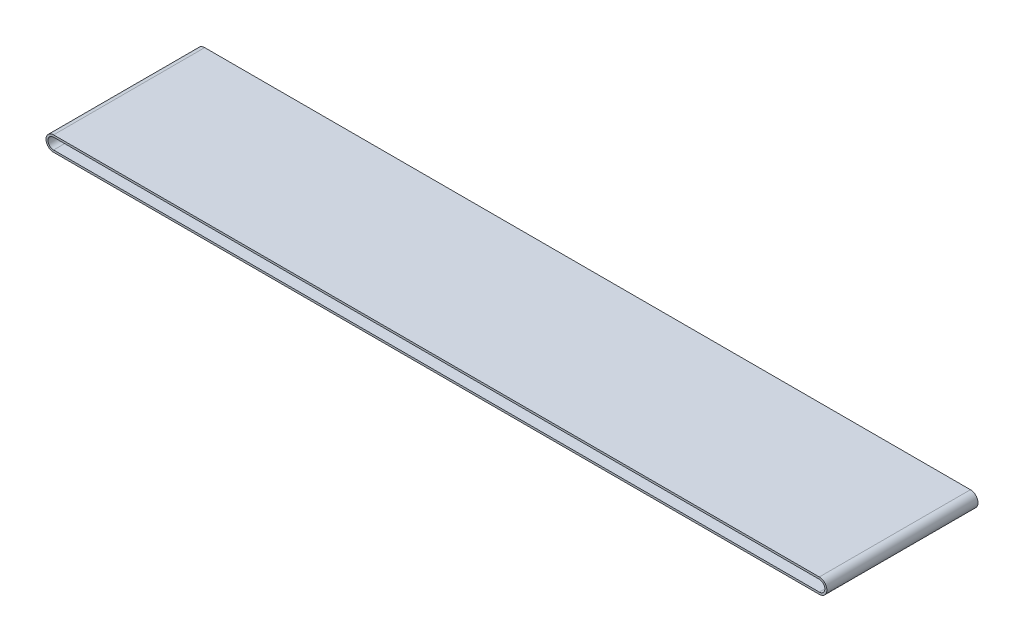
ISO-10303-21;
HEADER;
FILE_DESCRIPTION(('STEP AP214'),'2;1');
FILE_NAME('part.step','',(''),(''),'','','');
FILE_SCHEMA(('AUTOMOTIVE_DESIGN { 1 0 10303 214 1 1 1 1 }'));
ENDSEC;
DATA;
#1=APPLICATION_CONTEXT('core data for automotive mechanical design processes');
#2=APPLICATION_PROTOCOL_DEFINITION('international standard','automotive_design',2000,#1);
#3=PRODUCT_CONTEXT('',#1,'mechanical');
#4=PRODUCT('Part','Part','',(#3));
#5=PRODUCT_RELATED_PRODUCT_CATEGORY('part','',(#4));
#6=PRODUCT_DEFINITION_FORMATION('','',#4);
#7=PRODUCT_DEFINITION_CONTEXT('part definition',#1,'design');
#8=PRODUCT_DEFINITION('design','',#6,#7);
#9=PRODUCT_DEFINITION_SHAPE('','',#8);
#10=(LENGTH_UNIT() NAMED_UNIT(*) SI_UNIT(.MILLI.,.METRE.));
#11=(NAMED_UNIT(*) PLANE_ANGLE_UNIT() SI_UNIT($,.RADIAN.));
#12=(NAMED_UNIT(*) SI_UNIT($,.STERADIAN.) SOLID_ANGLE_UNIT());
#13=UNCERTAINTY_MEASURE_WITH_UNIT(LENGTH_MEASURE(1.E-05),#10,'distance_accuracy_value','');
#14=(GEOMETRIC_REPRESENTATION_CONTEXT(3) GLOBAL_UNCERTAINTY_ASSIGNED_CONTEXT((#13)) GLOBAL_UNIT_ASSIGNED_CONTEXT((#10,
#11,#12)) REPRESENTATION_CONTEXT('',''));
#15=CARTESIAN_POINT('',(0.,0.,0.));
#16=DIRECTION('',(0.,0.,1.));
#17=DIRECTION('',(1.,0.,0.));
#18=AXIS2_PLACEMENT_3D('',#15,#16,#17);
#19=CARTESIAN_POINT('',(0.,0.,381.));
#20=DIRECTION('',(0.,0.,1.));
#21=DIRECTION('',(1.,0.,0.));
#22=AXIS2_PLACEMENT_3D('',#19,#20,#21);
#23=PLANE('',#22);
#24=CARTESIAN_POINT('',(0.,0.,381.));
#25=DIRECTION('',(0.,0.,1.));
#26=DIRECTION('',(1.,0.,0.));
#27=AXIS2_PLACEMENT_3D('',#24,#25,#26);
#28=CIRCLE('',#27,38.0999999999998);
#29=CARTESIAN_POINT('',(0.,38.0999999999998,381.));
#30=VERTEX_POINT('',#29);
#31=CARTESIAN_POINT('',(0.,-38.0999999999998,381.));
#32=VERTEX_POINT('',#31);
#33=EDGE_CURVE('E140',#30,#32,#28,.T.);
#34=ORIENTED_EDGE('',*,*,#33,.T.);
#35=DIRECTION('',(1.,0.,0.));
#36=VECTOR('',#35,1.);
#37=CARTESIAN_POINT('',(0.,-38.0999999999998,381.));
#38=LINE('',#37,#36);
#39=CARTESIAN_POINT('',(3860.8,-38.0999999999998,381.));
#40=VERTEX_POINT('',#39);
#41=EDGE_CURVE('E143',#32,#40,#38,.T.);
#42=ORIENTED_EDGE('',*,*,#41,.T.);
#43=CARTESIAN_POINT('',(3860.8,0.,381.));
#44=DIRECTION('',(0.,0.,1.));
#45=DIRECTION('',(1.,0.,0.));
#46=AXIS2_PLACEMENT_3D('',#43,#44,#45);
#47=CIRCLE('',#46,38.0999999999998);
#48=CARTESIAN_POINT('',(3860.8,38.0999999999998,381.));
#49=VERTEX_POINT('',#48);
#50=EDGE_CURVE('E146',#40,#49,#47,.T.);
#51=ORIENTED_EDGE('',*,*,#50,.T.);
#52=DIRECTION('',(-1.,0.,0.));
#53=VECTOR('',#52,1.);
#54=CARTESIAN_POINT('',(0.,38.0999999999998,381.));
#55=LINE('',#54,#53);
#56=EDGE_CURVE('E148',#49,#30,#55,.T.);
#57=ORIENTED_EDGE('',*,*,#56,.T.);
#58=EDGE_LOOP('',(#34,#42,#51,#57));
#59=FACE_BOUND('',#58,.T.);
#60=DIRECTION('',(1.,0.,0.));
#61=VECTOR('',#60,1.);
#62=CARTESIAN_POINT('',(0.,-27.9399999999998,381.));
#63=LINE('',#62,#61);
#64=CARTESIAN_POINT('',(0.,-27.9399999999998,381.));
#65=VERTEX_POINT('',#64);
#66=CARTESIAN_POINT('',(3860.8,-27.9399999999998,381.));
#67=VERTEX_POINT('',#66);
#68=EDGE_CURVE('E112',#65,#67,#63,.T.);
#69=ORIENTED_EDGE('',*,*,#68,.F.);
#70=CARTESIAN_POINT('',(0.,0.,381.));
#71=DIRECTION('',(0.,0.,1.));
#72=DIRECTION('',(1.,0.,0.));
#73=AXIS2_PLACEMENT_3D('',#70,#71,#72);
#74=CIRCLE('',#73,27.94);
#75=CARTESIAN_POINT('',(0.,27.9400000000002,381.));
#76=VERTEX_POINT('',#75);
#77=EDGE_CURVE('E104',#76,#65,#74,.T.);
#78=ORIENTED_EDGE('',*,*,#77,.F.);
#79=DIRECTION('',(-1.,0.,0.));
#80=VECTOR('',#79,1.);
#81=CARTESIAN_POINT('',(0.,27.9400000000002,381.));
#82=LINE('',#81,#80);
#83=CARTESIAN_POINT('',(3860.8,27.9399999999998,381.));
#84=VERTEX_POINT('',#83);
#85=EDGE_CURVE('E126',#84,#76,#82,.T.);
#86=ORIENTED_EDGE('',*,*,#85,.F.);
#87=CARTESIAN_POINT('',(3860.8,0.,381.));
#88=DIRECTION('',(0.,0.,1.));
#89=DIRECTION('',(1.,0.,0.));
#90=AXIS2_PLACEMENT_3D('',#87,#88,#89);
#91=CIRCLE('',#90,27.9399999999998);
#92=EDGE_CURVE('E124',#67,#84,#91,.T.);
#93=ORIENTED_EDGE('',*,*,#92,.F.);
#94=EDGE_LOOP('',(#69,#78,#86,#93));
#95=FACE_BOUND('',#94,.T.);
#96=ADVANCED_FACE('F39',(#59,#95),#23,.T.);
#97=CARTESIAN_POINT('',(0.,0.,-381.));
#98=DIRECTION('',(0.,0.,1.));
#99=DIRECTION('',(1.,0.,0.));
#100=AXIS2_PLACEMENT_3D('',#97,#98,#99);
#101=PLANE('',#100);
#102=CARTESIAN_POINT('',(0.,0.,-381.));
#103=DIRECTION('',(0.,0.,1.));
#104=DIRECTION('',(1.,0.,0.));
#105=AXIS2_PLACEMENT_3D('',#102,#103,#104);
#106=CIRCLE('',#105,38.0999999999998);
#107=CARTESIAN_POINT('',(0.,38.0999999999998,-381.));
#108=VERTEX_POINT('',#107);
#109=CARTESIAN_POINT('',(0.,-38.0999999999998,-381.));
#110=VERTEX_POINT('',#109);
#111=EDGE_CURVE('E120',#108,#110,#106,.T.);
#112=ORIENTED_EDGE('',*,*,#111,.F.);
#113=DIRECTION('',(-1.,0.,0.));
#114=VECTOR('',#113,1.);
#115=CARTESIAN_POINT('',(0.,38.0999999999998,-381.));
#116=LINE('',#115,#114);
#117=CARTESIAN_POINT('',(3860.8,38.0999999999998,-381.));
#118=VERTEX_POINT('',#117);
#119=EDGE_CURVE('E144',#118,#108,#116,.T.);
#120=ORIENTED_EDGE('',*,*,#119,.F.);
#121=CARTESIAN_POINT('',(3860.8,0.,-381.));
#122=DIRECTION('',(0.,0.,1.));
#123=DIRECTION('',(1.,0.,0.));
#124=AXIS2_PLACEMENT_3D('',#121,#122,#123);
#125=CIRCLE('',#124,38.0999999999998);
#126=CARTESIAN_POINT('',(3860.8,-38.0999999999998,-381.));
#127=VERTEX_POINT('',#126);
#128=EDGE_CURVE('E155',#127,#118,#125,.T.);
#129=ORIENTED_EDGE('',*,*,#128,.F.);
#130=DIRECTION('',(1.,0.,0.));
#131=VECTOR('',#130,1.);
#132=CARTESIAN_POINT('',(0.,-38.0999999999998,-381.));
#133=LINE('',#132,#131);
#134=EDGE_CURVE('E153',#110,#127,#133,.T.);
#135=ORIENTED_EDGE('',*,*,#134,.F.);
#136=EDGE_LOOP('',(#112,#120,#129,#135));
#137=FACE_BOUND('',#136,.T.);
#138=CARTESIAN_POINT('',(0.,0.,-381.));
#139=DIRECTION('',(0.,0.,1.));
#140=DIRECTION('',(1.,0.,0.));
#141=AXIS2_PLACEMENT_3D('',#138,#139,#140);
#142=CIRCLE('',#141,27.94);
#143=CARTESIAN_POINT('',(0.,27.9400000000002,-381.));
#144=VERTEX_POINT('',#143);
#145=CARTESIAN_POINT('',(0.,-27.9399999999998,-381.));
#146=VERTEX_POINT('',#145);
#147=EDGE_CURVE('E62',#144,#146,#142,.T.);
#148=ORIENTED_EDGE('',*,*,#147,.T.);
#149=DIRECTION('',(1.,0.,0.));
#150=VECTOR('',#149,1.);
#151=CARTESIAN_POINT('',(0.,-27.9399999999998,-381.));
#152=LINE('',#151,#150);
#153=CARTESIAN_POINT('',(3860.8,-27.9399999999998,-381.));
#154=VERTEX_POINT('',#153);
#155=EDGE_CURVE('E119',#146,#154,#152,.T.);
#156=ORIENTED_EDGE('',*,*,#155,.T.);
#157=CARTESIAN_POINT('',(3860.8,0.,-381.));
#158=DIRECTION('',(0.,0.,1.));
#159=DIRECTION('',(1.,0.,0.));
#160=AXIS2_PLACEMENT_3D('',#157,#158,#159);
#161=CIRCLE('',#160,27.9399999999998);
#162=CARTESIAN_POINT('',(3860.8,27.9399999999998,-381.));
#163=VERTEX_POINT('',#162);
#164=EDGE_CURVE('E132',#154,#163,#161,.T.);
#165=ORIENTED_EDGE('',*,*,#164,.T.);
#166=DIRECTION('',(-1.,0.,0.));
#167=VECTOR('',#166,1.);
#168=CARTESIAN_POINT('',(0.,27.9400000000002,-381.));
#169=LINE('',#168,#167);
#170=EDGE_CURVE('E113',#163,#144,#169,.T.);
#171=ORIENTED_EDGE('',*,*,#170,.T.);
#172=EDGE_LOOP('',(#148,#156,#165,#171));
#173=FACE_BOUND('',#172,.T.);
#174=ADVANCED_FACE('F173',(#137,#173),#101,.F.);
#175=CARTESIAN_POINT('',(0.,0.,381.));
#176=DIRECTION('',(0.,0.,-1.));
#177=DIRECTION('',(-1.,0.,0.));
#178=AXIS2_PLACEMENT_3D('',#175,#176,#177);
#179=CYLINDRICAL_SURFACE('',#178,38.0999999999998);
#180=ORIENTED_EDGE('',*,*,#111,.T.);
#181=DIRECTION('',(0.,0.,-1.));
#182=VECTOR('',#181,1.);
#183=CARTESIAN_POINT('',(0.,-38.0999999999998,381.));
#184=LINE('',#183,#182);
#185=EDGE_CURVE('E11',#32,#110,#184,.T.);
#186=ORIENTED_EDGE('',*,*,#185,.F.);
#187=ORIENTED_EDGE('',*,*,#33,.F.);
#188=DIRECTION('',(0.,0.,-1.));
#189=VECTOR('',#188,1.);
#190=CARTESIAN_POINT('',(0.,38.0999999999998,381.));
#191=LINE('',#190,#189);
#192=EDGE_CURVE('E150',#30,#108,#191,.T.);
#193=ORIENTED_EDGE('',*,*,#192,.T.);
#194=EDGE_LOOP('',(#180,#186,#187,#193));
#195=FACE_BOUND('',#194,.T.);
#196=ADVANCED_FACE('F41',(#195),#179,.T.);
#197=CARTESIAN_POINT('',(0.,-38.0999999999998,381.));
#198=DIRECTION('',(0.,1.,0.));
#199=DIRECTION('',(0.,0.,1.));
#200=AXIS2_PLACEMENT_3D('',#197,#198,#199);
#201=PLANE('',#200);
#202=ORIENTED_EDGE('',*,*,#134,.T.);
#203=DIRECTION('',(0.,0.,-1.));
#204=VECTOR('',#203,1.);
#205=CARTESIAN_POINT('',(3860.8,-38.0999999999998,381.));
#206=LINE('',#205,#204);
#207=EDGE_CURVE('E47',#40,#127,#206,.T.);
#208=ORIENTED_EDGE('',*,*,#207,.F.);
#209=ORIENTED_EDGE('',*,*,#41,.F.);
#210=ORIENTED_EDGE('',*,*,#185,.T.);
#211=EDGE_LOOP('',(#202,#208,#209,#210));
#212=FACE_BOUND('',#211,.T.);
#213=ADVANCED_FACE('F183',(#212),#201,.F.);
#214=CARTESIAN_POINT('',(3860.8,0.,381.));
#215=DIRECTION('',(0.,0.,-1.));
#216=DIRECTION('',(-1.,0.,0.));
#217=AXIS2_PLACEMENT_3D('',#214,#215,#216);
#218=CYLINDRICAL_SURFACE('',#217,38.0999999999998);
#219=ORIENTED_EDGE('',*,*,#128,.T.);
#220=DIRECTION('',(0.,0.,-1.));
#221=VECTOR('',#220,1.);
#222=CARTESIAN_POINT('',(3860.8,38.0999999999998,381.));
#223=LINE('',#222,#221);
#224=EDGE_CURVE('E160',#49,#118,#223,.T.);
#225=ORIENTED_EDGE('',*,*,#224,.F.);
#226=ORIENTED_EDGE('',*,*,#50,.F.);
#227=ORIENTED_EDGE('',*,*,#207,.T.);
#228=EDGE_LOOP('',(#219,#225,#226,#227));
#229=FACE_BOUND('',#228,.T.);
#230=ADVANCED_FACE('F167',(#229),#218,.T.);
#231=CARTESIAN_POINT('',(0.,38.0999999999998,381.));
#232=DIRECTION('',(0.,-1.,0.));
#233=DIRECTION('',(0.,0.,-1.));
#234=AXIS2_PLACEMENT_3D('',#231,#232,#233);
#235=PLANE('',#234);
#236=ORIENTED_EDGE('',*,*,#119,.T.);
#237=ORIENTED_EDGE('',*,*,#192,.F.);
#238=ORIENTED_EDGE('',*,*,#56,.F.);
#239=ORIENTED_EDGE('',*,*,#224,.T.);
#240=EDGE_LOOP('',(#236,#237,#238,#239));
#241=FACE_BOUND('',#240,.T.);
#242=ADVANCED_FACE('F177',(#241),#235,.F.);
#243=CARTESIAN_POINT('',(0.,0.,381.));
#244=DIRECTION('',(0.,0.,-1.));
#245=DIRECTION('',(-1.,0.,0.));
#246=AXIS2_PLACEMENT_3D('',#243,#244,#245);
#247=CYLINDRICAL_SURFACE('',#246,27.94);
#248=ORIENTED_EDGE('',*,*,#147,.F.);
#249=DIRECTION('',(0.,0.,-1.));
#250=VECTOR('',#249,1.);
#251=CARTESIAN_POINT('',(0.,27.9400000000002,381.));
#252=LINE('',#251,#250);
#253=EDGE_CURVE('E108',#76,#144,#252,.T.);
#254=ORIENTED_EDGE('',*,*,#253,.F.);
#255=ORIENTED_EDGE('',*,*,#77,.T.);
#256=DIRECTION('',(0.,0.,-1.));
#257=VECTOR('',#256,1.);
#258=CARTESIAN_POINT('',(0.,-27.9399999999998,381.));
#259=LINE('',#258,#257);
#260=EDGE_CURVE('E107',#65,#146,#259,.T.);
#261=ORIENTED_EDGE('',*,*,#260,.T.);
#262=EDGE_LOOP('',(#248,#254,#255,#261));
#263=FACE_BOUND('',#262,.T.);
#264=ADVANCED_FACE('F106',(#263),#247,.F.);
#265=CARTESIAN_POINT('',(0.,-27.9399999999998,381.));
#266=DIRECTION('',(0.,1.,0.));
#267=DIRECTION('',(0.,0.,1.));
#268=AXIS2_PLACEMENT_3D('',#265,#266,#267);
#269=PLANE('',#268);
#270=ORIENTED_EDGE('',*,*,#155,.F.);
#271=ORIENTED_EDGE('',*,*,#260,.F.);
#272=ORIENTED_EDGE('',*,*,#68,.T.);
#273=DIRECTION('',(0.,0.,-1.));
#274=VECTOR('',#273,1.);
#275=CARTESIAN_POINT('',(3860.8,-27.9399999999998,381.));
#276=LINE('',#275,#274);
#277=EDGE_CURVE('E121',#67,#154,#276,.T.);
#278=ORIENTED_EDGE('',*,*,#277,.T.);
#279=EDGE_LOOP('',(#270,#271,#272,#278));
#280=FACE_BOUND('',#279,.T.);
#281=ADVANCED_FACE('F116',(#280),#269,.T.);
#282=CARTESIAN_POINT('',(3860.8,0.,381.));
#283=DIRECTION('',(0.,0.,-1.));
#284=DIRECTION('',(-1.,0.,0.));
#285=AXIS2_PLACEMENT_3D('',#282,#283,#284);
#286=CYLINDRICAL_SURFACE('',#285,27.9399999999998);
#287=ORIENTED_EDGE('',*,*,#164,.F.);
#288=ORIENTED_EDGE('',*,*,#277,.F.);
#289=ORIENTED_EDGE('',*,*,#92,.T.);
#290=DIRECTION('',(0.,0.,-1.));
#291=VECTOR('',#290,1.);
#292=CARTESIAN_POINT('',(3860.8,27.9399999999998,381.));
#293=LINE('',#292,#291);
#294=EDGE_CURVE('E54',#84,#163,#293,.T.);
#295=ORIENTED_EDGE('',*,*,#294,.T.);
#296=EDGE_LOOP('',(#287,#288,#289,#295));
#297=FACE_BOUND('',#296,.T.);
#298=ADVANCED_FACE('F206',(#297),#286,.F.);
#299=CARTESIAN_POINT('',(0.,27.9400000000002,381.));
#300=DIRECTION('',(0.,-1.,0.));
#301=DIRECTION('',(1.,0.,0.));
#302=AXIS2_PLACEMENT_3D('',#299,#300,#301);
#303=PLANE('',#302);
#304=ORIENTED_EDGE('',*,*,#170,.F.);
#305=ORIENTED_EDGE('',*,*,#294,.F.);
#306=ORIENTED_EDGE('',*,*,#85,.T.);
#307=ORIENTED_EDGE('',*,*,#253,.T.);
#308=EDGE_LOOP('',(#304,#305,#306,#307));
#309=FACE_BOUND('',#308,.T.);
#310=ADVANCED_FACE('F210',(#309),#303,.T.);
#311=CLOSED_SHELL('',(#96,#174,#196,#213,#230,#242,#264,#281,#298,#310));
#312=MANIFOLD_SOLID_BREP('B2',#311);
#313=ADVANCED_BREP_SHAPE_REPRESENTATION('',(#18,#312),#14);
#314=SHAPE_DEFINITION_REPRESENTATION(#9,#313);
ENDSEC;
END-ISO-10303-21;
